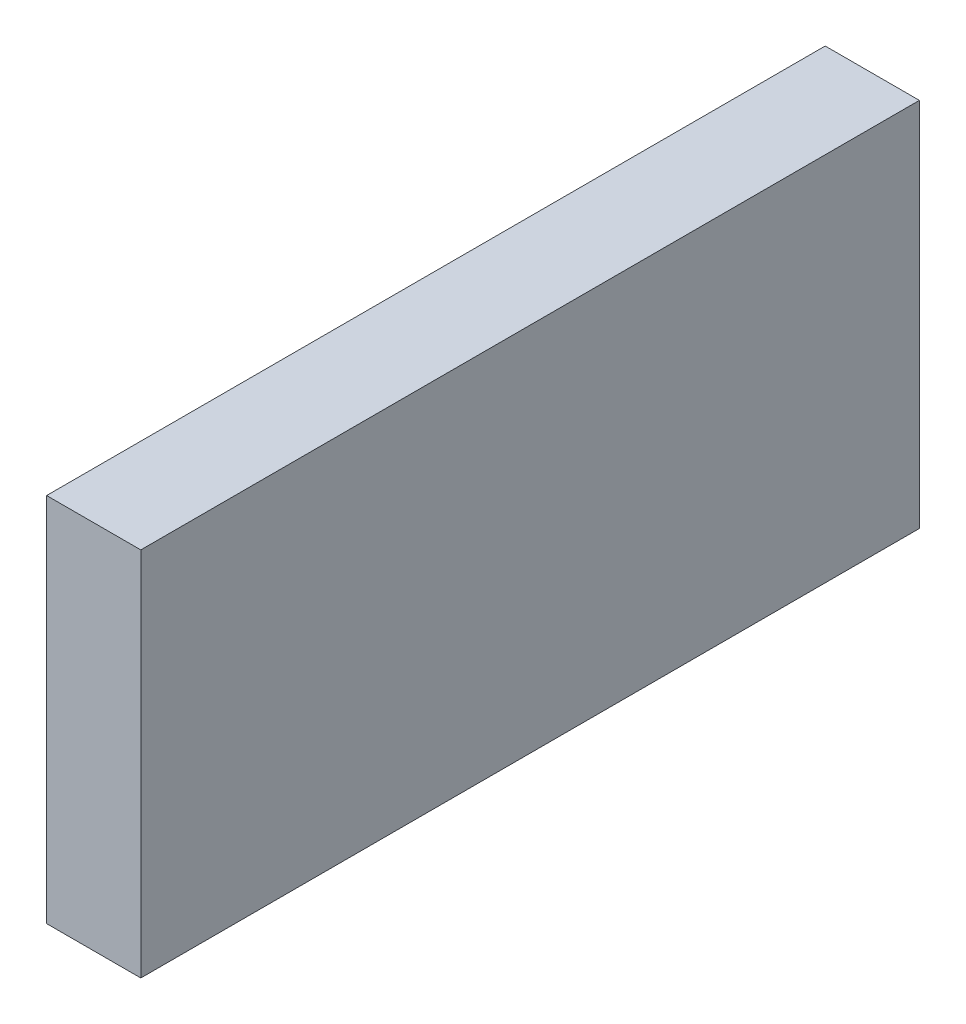
ISO-10303-21;
HEADER;
FILE_DESCRIPTION(('STEP AP214'),'2;1');
FILE_NAME('part.step','',(''),(''),'','','');
FILE_SCHEMA(('AUTOMOTIVE_DESIGN { 1 0 10303 214 1 1 1 1 }'));
ENDSEC;
DATA;
#1=APPLICATION_CONTEXT('core data for automotive mechanical design processes');
#2=APPLICATION_PROTOCOL_DEFINITION('international standard','automotive_design',2000,#1);
#3=PRODUCT_CONTEXT('',#1,'mechanical');
#4=PRODUCT('Part','Part','',(#3));
#5=PRODUCT_RELATED_PRODUCT_CATEGORY('part','',(#4));
#6=PRODUCT_DEFINITION_FORMATION('','',#4);
#7=PRODUCT_DEFINITION_CONTEXT('part definition',#1,'design');
#8=PRODUCT_DEFINITION('design','',#6,#7);
#9=PRODUCT_DEFINITION_SHAPE('','',#8);
#10=(LENGTH_UNIT() NAMED_UNIT(*) SI_UNIT(.MILLI.,.METRE.));
#11=(NAMED_UNIT(*) PLANE_ANGLE_UNIT() SI_UNIT($,.RADIAN.));
#12=(NAMED_UNIT(*) SI_UNIT($,.STERADIAN.) SOLID_ANGLE_UNIT());
#13=UNCERTAINTY_MEASURE_WITH_UNIT(LENGTH_MEASURE(1.E-05),#10,'distance_accuracy_value','');
#14=(GEOMETRIC_REPRESENTATION_CONTEXT(3) GLOBAL_UNCERTAINTY_ASSIGNED_CONTEXT((#13)) GLOBAL_UNIT_ASSIGNED_CONTEXT((#10,
#11,#12)) REPRESENTATION_CONTEXT('',''));
#15=CARTESIAN_POINT('',(0.,0.,0.));
#16=DIRECTION('',(0.,0.,1.));
#17=DIRECTION('',(1.,0.,0.));
#18=AXIS2_PLACEMENT_3D('',#15,#16,#17);
#19=CARTESIAN_POINT('',(5.08,18.2069452010426,30.5891220132253));
#20=DIRECTION('',(0.,0.,-1.));
#21=DIRECTION('',(0.,1.,0.));
#22=AXIS2_PLACEMENT_3D('',#19,#20,#21);
#23=PLANE('',#22);
#24=DIRECTION('',(0.,-1.,0.));
#25=VECTOR('',#24,1.);
#26=CARTESIAN_POINT('',(0.,18.2069452010426,30.5891220132253));
#27=LINE('',#26,#25);
#28=CARTESIAN_POINT('',(0.,18.2069452010426,30.5891220132253));
#29=VERTEX_POINT('',#28);
#30=CARTESIAN_POINT('',(0.,-1.79305479895742,30.5891220132253));
#31=VERTEX_POINT('',#30);
#32=EDGE_CURVE('E96',#29,#31,#27,.T.);
#33=ORIENTED_EDGE('',*,*,#32,.T.);
#34=DIRECTION('',(-1.,0.,0.));
#35=VECTOR('',#34,1.);
#36=CARTESIAN_POINT('',(5.08,-1.79305479895742,30.5891220132253));
#37=LINE('',#36,#35);
#38=CARTESIAN_POINT('',(5.08,-1.79305479895742,30.5891220132253));
#39=VERTEX_POINT('',#38);
#40=EDGE_CURVE('E11',#39,#31,#37,.T.);
#41=ORIENTED_EDGE('',*,*,#40,.F.);
#42=DIRECTION('',(0.,-1.,0.));
#43=VECTOR('',#42,1.);
#44=CARTESIAN_POINT('',(5.08,18.2069452010426,30.5891220132253));
#45=LINE('',#44,#43);
#46=CARTESIAN_POINT('',(5.08,18.2069452010426,30.5891220132253));
#47=VERTEX_POINT('',#46);
#48=EDGE_CURVE('E84',#47,#39,#45,.T.);
#49=ORIENTED_EDGE('',*,*,#48,.F.);
#50=DIRECTION('',(-1.,0.,0.));
#51=VECTOR('',#50,1.);
#52=CARTESIAN_POINT('',(5.08,18.2069452010426,30.5891220132253));
#53=LINE('',#52,#51);
#54=EDGE_CURVE('E92',#47,#29,#53,.T.);
#55=ORIENTED_EDGE('',*,*,#54,.T.);
#56=EDGE_LOOP('',(#33,#41,#49,#55));
#57=FACE_BOUND('',#56,.T.);
#58=ADVANCED_FACE('F33',(#57),#23,.F.);
#59=CARTESIAN_POINT('',(5.08,-1.79305479895742,30.5891220132253));
#60=DIRECTION('',(0.,1.,0.));
#61=DIRECTION('',(0.,0.,1.));
#62=AXIS2_PLACEMENT_3D('',#59,#60,#61);
#63=PLANE('',#62);
#64=DIRECTION('',(0.,0.,-1.));
#65=VECTOR('',#64,1.);
#66=CARTESIAN_POINT('',(0.,-1.79305479895742,30.5891220132253));
#67=LINE('',#66,#65);
#68=CARTESIAN_POINT('',(0.,-1.79305479895742,-11.4108779867747));
#69=VERTEX_POINT('',#68);
#70=EDGE_CURVE('E88',#31,#69,#67,.T.);
#71=ORIENTED_EDGE('',*,*,#70,.T.);
#72=DIRECTION('',(-1.,0.,0.));
#73=VECTOR('',#72,1.);
#74=CARTESIAN_POINT('',(5.08,-1.79305479895742,-11.4108779867747));
#75=LINE('',#74,#73);
#76=CARTESIAN_POINT('',(5.08,-1.79305479895742,-11.4108779867747));
#77=VERTEX_POINT('',#76);
#78=EDGE_CURVE('E41',#77,#69,#75,.T.);
#79=ORIENTED_EDGE('',*,*,#78,.F.);
#80=DIRECTION('',(0.,0.,-1.));
#81=VECTOR('',#80,1.);
#82=CARTESIAN_POINT('',(5.08,-1.79305479895742,30.5891220132253));
#83=LINE('',#82,#81);
#84=EDGE_CURVE('E79',#39,#77,#83,.T.);
#85=ORIENTED_EDGE('',*,*,#84,.F.);
#86=ORIENTED_EDGE('',*,*,#40,.T.);
#87=EDGE_LOOP('',(#71,#79,#85,#86));
#88=FACE_BOUND('',#87,.T.);
#89=ADVANCED_FACE('F87',(#88),#63,.F.);
#90=CARTESIAN_POINT('',(5.08,18.2069452010426,-11.4108779867747));
#91=DIRECTION('',(0.,0.,1.));
#92=DIRECTION('',(1.,0.,0.));
#93=AXIS2_PLACEMENT_3D('',#90,#91,#92);
#94=PLANE('',#93);
#95=DIRECTION('',(0.,1.,0.));
#96=VECTOR('',#95,1.);
#97=CARTESIAN_POINT('',(0.,18.2069452010426,-11.4108779867747));
#98=LINE('',#97,#96);
#99=CARTESIAN_POINT('',(0.,18.2069452010426,-11.4108779867747));
#100=VERTEX_POINT('',#99);
#101=EDGE_CURVE('E66',#69,#100,#98,.T.);
#102=ORIENTED_EDGE('',*,*,#101,.T.);
#103=DIRECTION('',(-1.,0.,0.));
#104=VECTOR('',#103,1.);
#105=CARTESIAN_POINT('',(5.08,18.2069452010426,-11.4108779867747));
#106=LINE('',#105,#104);
#107=CARTESIAN_POINT('',(5.08,18.2069452010426,-11.4108779867747));
#108=VERTEX_POINT('',#107);
#109=EDGE_CURVE('E89',#108,#100,#106,.T.);
#110=ORIENTED_EDGE('',*,*,#109,.F.);
#111=DIRECTION('',(0.,1.,0.));
#112=VECTOR('',#111,1.);
#113=CARTESIAN_POINT('',(5.08,18.2069452010426,-11.4108779867747));
#114=LINE('',#113,#112);
#115=EDGE_CURVE('E82',#77,#108,#114,.T.);
#116=ORIENTED_EDGE('',*,*,#115,.F.);
#117=ORIENTED_EDGE('',*,*,#78,.T.);
#118=EDGE_LOOP('',(#102,#110,#116,#117));
#119=FACE_BOUND('',#118,.T.);
#120=ADVANCED_FACE('F90',(#119),#94,.F.);
#121=CARTESIAN_POINT('',(5.08,18.2069452010426,30.5891220132253));
#122=DIRECTION('',(0.,-1.,0.));
#123=DIRECTION('',(0.,0.,-1.));
#124=AXIS2_PLACEMENT_3D('',#121,#122,#123);
#125=PLANE('',#124);
#126=DIRECTION('',(0.,0.,1.));
#127=VECTOR('',#126,1.);
#128=CARTESIAN_POINT('',(0.,18.2069452010426,30.5891220132253));
#129=LINE('',#128,#127);
#130=EDGE_CURVE('E72',#100,#29,#129,.T.);
#131=ORIENTED_EDGE('',*,*,#130,.T.);
#132=ORIENTED_EDGE('',*,*,#54,.F.);
#133=DIRECTION('',(0.,0.,1.));
#134=VECTOR('',#133,1.);
#135=CARTESIAN_POINT('',(5.08,18.2069452010426,30.5891220132253));
#136=LINE('',#135,#134);
#137=EDGE_CURVE('E49',#108,#47,#136,.T.);
#138=ORIENTED_EDGE('',*,*,#137,.F.);
#139=ORIENTED_EDGE('',*,*,#109,.T.);
#140=EDGE_LOOP('',(#131,#132,#138,#139));
#141=FACE_BOUND('',#140,.T.);
#142=ADVANCED_FACE('F103',(#141),#125,.F.);
#143=CARTESIAN_POINT('',(5.08,0.,0.));
#144=DIRECTION('',(1.,0.,0.));
#145=DIRECTION('',(0.,0.,-1.));
#146=AXIS2_PLACEMENT_3D('',#143,#144,#145);
#147=PLANE('',#146);
#148=ORIENTED_EDGE('',*,*,#48,.T.);
#149=ORIENTED_EDGE('',*,*,#84,.T.);
#150=ORIENTED_EDGE('',*,*,#115,.T.);
#151=ORIENTED_EDGE('',*,*,#137,.T.);
#152=EDGE_LOOP('',(#148,#149,#150,#151));
#153=FACE_BOUND('',#152,.T.);
#154=ADVANCED_FACE('F80',(#153),#147,.T.);
#155=CARTESIAN_POINT('',(0.,0.,0.));
#156=DIRECTION('',(1.,0.,0.));
#157=DIRECTION('',(0.,0.,-1.));
#158=AXIS2_PLACEMENT_3D('',#155,#156,#157);
#159=PLANE('',#158);
#160=ORIENTED_EDGE('',*,*,#32,.F.);
#161=ORIENTED_EDGE('',*,*,#130,.F.);
#162=ORIENTED_EDGE('',*,*,#101,.F.);
#163=ORIENTED_EDGE('',*,*,#70,.F.);
#164=EDGE_LOOP('',(#160,#161,#162,#163));
#165=FACE_BOUND('',#164,.T.);
#166=ADVANCED_FACE('F106',(#165),#159,.F.);
#167=CLOSED_SHELL('',(#58,#89,#120,#142,#154,#166));
#168=MANIFOLD_SOLID_BREP('B2',#167);
#169=ADVANCED_BREP_SHAPE_REPRESENTATION('',(#18,#168),#14);
#170=SHAPE_DEFINITION_REPRESENTATION(#9,#169);
ENDSEC;
END-ISO-10303-21;
